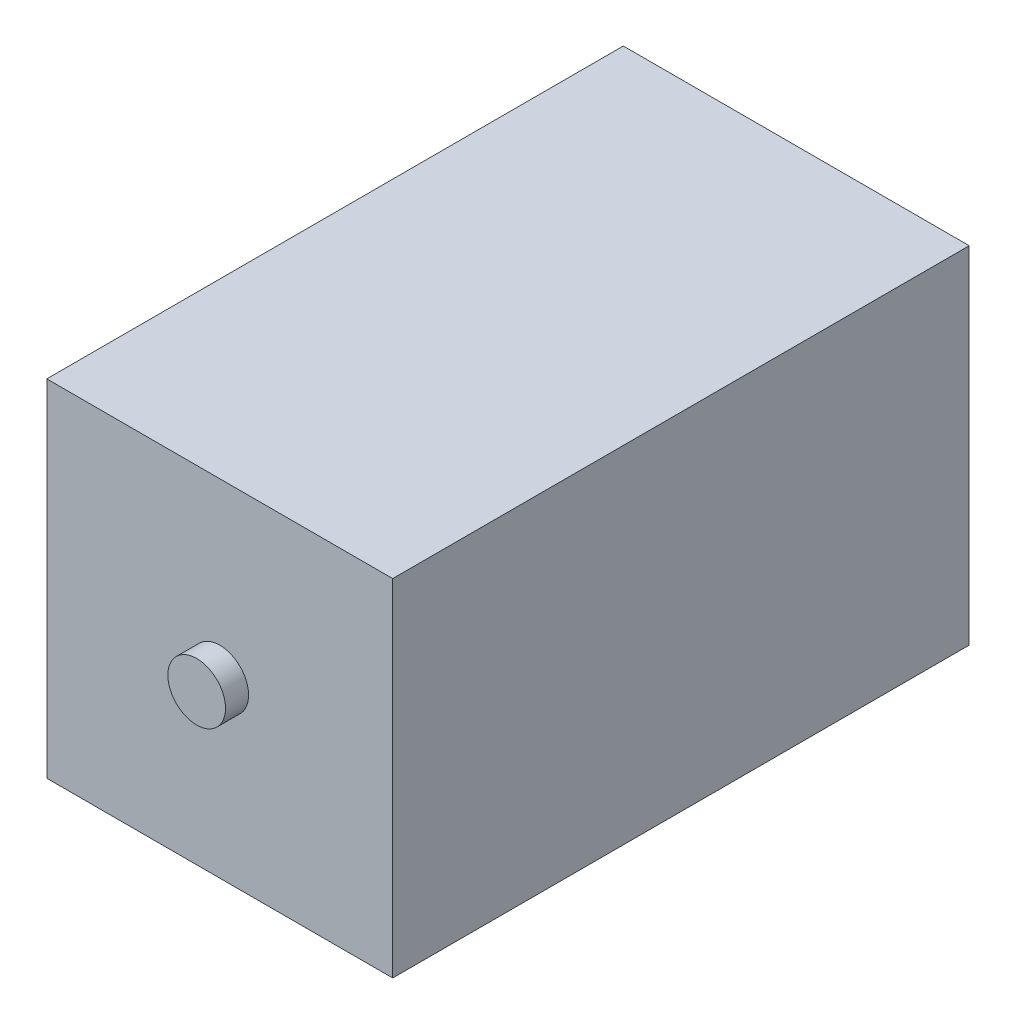
ISO-10303-21;
HEADER;
FILE_DESCRIPTION(('STEP AP214'),'2;1');
FILE_NAME('part.step','',(''),(''),'','','');
FILE_SCHEMA(('AUTOMOTIVE_DESIGN { 1 0 10303 214 1 1 1 1 }'));
ENDSEC;
DATA;
#1=APPLICATION_CONTEXT('core data for automotive mechanical design processes');
#2=APPLICATION_PROTOCOL_DEFINITION('international standard','automotive_design',2000,#1);
#3=PRODUCT_CONTEXT('',#1,'mechanical');
#4=PRODUCT('Part','Part','',(#3));
#5=PRODUCT_RELATED_PRODUCT_CATEGORY('part','',(#4));
#6=PRODUCT_DEFINITION_FORMATION('','',#4);
#7=PRODUCT_DEFINITION_CONTEXT('part definition',#1,'design');
#8=PRODUCT_DEFINITION('design','',#6,#7);
#9=PRODUCT_DEFINITION_SHAPE('','',#8);
#10=(LENGTH_UNIT() NAMED_UNIT(*) SI_UNIT(.MILLI.,.METRE.));
#11=(NAMED_UNIT(*) PLANE_ANGLE_UNIT() SI_UNIT($,.RADIAN.));
#12=(NAMED_UNIT(*) SI_UNIT($,.STERADIAN.) SOLID_ANGLE_UNIT());
#13=UNCERTAINTY_MEASURE_WITH_UNIT(LENGTH_MEASURE(1.E-05),#10,'distance_accuracy_value','');
#14=(GEOMETRIC_REPRESENTATION_CONTEXT(3) GLOBAL_UNCERTAINTY_ASSIGNED_CONTEXT((#13)) GLOBAL_UNIT_ASSIGNED_CONTEXT((#10,
#11,#12)) REPRESENTATION_CONTEXT('',''));
#15=CARTESIAN_POINT('',(0.,0.,0.));
#16=DIRECTION('',(0.,0.,1.));
#17=DIRECTION('',(1.,0.,0.));
#18=AXIS2_PLACEMENT_3D('',#15,#16,#17);
#19=CARTESIAN_POINT('',(0.,0.,250.));
#20=DIRECTION('',(0.,1.,0.));
#21=DIRECTION('',(0.,0.,1.));
#22=AXIS2_PLACEMENT_3D('',#19,#20,#21);
#23=PLANE('',#22);
#24=DIRECTION('',(1.,0.,0.));
#25=VECTOR('',#24,1.);
#26=CARTESIAN_POINT('',(0.,0.,0.));
#27=LINE('',#26,#25);
#28=CARTESIAN_POINT('',(0.,0.,0.));
#29=VERTEX_POINT('',#28);
#30=CARTESIAN_POINT('',(150.,0.,0.));
#31=VERTEX_POINT('',#30);
#32=EDGE_CURVE('E96',#29,#31,#27,.T.);
#33=ORIENTED_EDGE('',*,*,#32,.T.);
#34=DIRECTION('',(0.,0.,-1.));
#35=VECTOR('',#34,1.);
#36=CARTESIAN_POINT('',(150.,0.,250.));
#37=LINE('',#36,#35);
#38=CARTESIAN_POINT('',(150.,0.,250.));
#39=VERTEX_POINT('',#38);
#40=EDGE_CURVE('E11',#39,#31,#37,.T.);
#41=ORIENTED_EDGE('',*,*,#40,.F.);
#42=DIRECTION('',(1.,0.,0.));
#43=VECTOR('',#42,1.);
#44=CARTESIAN_POINT('',(0.,0.,250.));
#45=LINE('',#44,#43);
#46=CARTESIAN_POINT('',(0.,0.,250.));
#47=VERTEX_POINT('',#46);
#48=EDGE_CURVE('E84',#47,#39,#45,.T.);
#49=ORIENTED_EDGE('',*,*,#48,.F.);
#50=DIRECTION('',(0.,0.,-1.));
#51=VECTOR('',#50,1.);
#52=CARTESIAN_POINT('',(0.,0.,250.));
#53=LINE('',#52,#51);
#54=EDGE_CURVE('E92',#47,#29,#53,.T.);
#55=ORIENTED_EDGE('',*,*,#54,.T.);
#56=EDGE_LOOP('',(#33,#41,#49,#55));
#57=FACE_BOUND('',#56,.T.);
#58=ADVANCED_FACE('F33',(#57),#23,.F.);
#59=CARTESIAN_POINT('',(150.,0.,250.));
#60=DIRECTION('',(-1.,0.,0.));
#61=DIRECTION('',(0.,0.,1.));
#62=AXIS2_PLACEMENT_3D('',#59,#60,#61);
#63=PLANE('',#62);
#64=DIRECTION('',(0.,1.,0.));
#65=VECTOR('',#64,1.);
#66=CARTESIAN_POINT('',(150.,0.,0.));
#67=LINE('',#66,#65);
#68=CARTESIAN_POINT('',(150.,150.,0.));
#69=VERTEX_POINT('',#68);
#70=EDGE_CURVE('E88',#31,#69,#67,.T.);
#71=ORIENTED_EDGE('',*,*,#70,.T.);
#72=DIRECTION('',(0.,0.,-1.));
#73=VECTOR('',#72,1.);
#74=CARTESIAN_POINT('',(150.,150.,250.));
#75=LINE('',#74,#73);
#76=CARTESIAN_POINT('',(150.,150.,250.));
#77=VERTEX_POINT('',#76);
#78=EDGE_CURVE('E41',#77,#69,#75,.T.);
#79=ORIENTED_EDGE('',*,*,#78,.F.);
#80=DIRECTION('',(0.,1.,0.));
#81=VECTOR('',#80,1.);
#82=CARTESIAN_POINT('',(150.,0.,250.));
#83=LINE('',#82,#81);
#84=EDGE_CURVE('E79',#39,#77,#83,.T.);
#85=ORIENTED_EDGE('',*,*,#84,.F.);
#86=ORIENTED_EDGE('',*,*,#40,.T.);
#87=EDGE_LOOP('',(#71,#79,#85,#86));
#88=FACE_BOUND('',#87,.T.);
#89=ADVANCED_FACE('F87',(#88),#63,.F.);
#90=CARTESIAN_POINT('',(0.,150.,250.));
#91=DIRECTION('',(0.,-1.,0.));
#92=DIRECTION('',(0.,0.,-1.));
#93=AXIS2_PLACEMENT_3D('',#90,#91,#92);
#94=PLANE('',#93);
#95=DIRECTION('',(-1.,0.,0.));
#96=VECTOR('',#95,1.);
#97=CARTESIAN_POINT('',(0.,150.,0.));
#98=LINE('',#97,#96);
#99=CARTESIAN_POINT('',(0.,150.,0.));
#100=VERTEX_POINT('',#99);
#101=EDGE_CURVE('E66',#69,#100,#98,.T.);
#102=ORIENTED_EDGE('',*,*,#101,.T.);
#103=DIRECTION('',(0.,0.,-1.));
#104=VECTOR('',#103,1.);
#105=CARTESIAN_POINT('',(0.,150.,250.));
#106=LINE('',#105,#104);
#107=CARTESIAN_POINT('',(0.,150.,250.));
#108=VERTEX_POINT('',#107);
#109=EDGE_CURVE('E89',#108,#100,#106,.T.);
#110=ORIENTED_EDGE('',*,*,#109,.F.);
#111=DIRECTION('',(-1.,0.,0.));
#112=VECTOR('',#111,1.);
#113=CARTESIAN_POINT('',(0.,150.,250.));
#114=LINE('',#113,#112);
#115=EDGE_CURVE('E82',#77,#108,#114,.T.);
#116=ORIENTED_EDGE('',*,*,#115,.F.);
#117=ORIENTED_EDGE('',*,*,#78,.T.);
#118=EDGE_LOOP('',(#102,#110,#116,#117));
#119=FACE_BOUND('',#118,.T.);
#120=ADVANCED_FACE('F90',(#119),#94,.F.);
#121=CARTESIAN_POINT('',(0.,0.,250.));
#122=DIRECTION('',(1.,0.,0.));
#123=DIRECTION('',(0.,0.,-1.));
#124=AXIS2_PLACEMENT_3D('',#121,#122,#123);
#125=PLANE('',#124);
#126=DIRECTION('',(0.,-1.,0.));
#127=VECTOR('',#126,1.);
#128=CARTESIAN_POINT('',(0.,0.,0.));
#129=LINE('',#128,#127);
#130=EDGE_CURVE('E72',#100,#29,#129,.T.);
#131=ORIENTED_EDGE('',*,*,#130,.T.);
#132=ORIENTED_EDGE('',*,*,#54,.F.);
#133=DIRECTION('',(0.,-1.,0.));
#134=VECTOR('',#133,1.);
#135=CARTESIAN_POINT('',(0.,0.,250.));
#136=LINE('',#135,#134);
#137=EDGE_CURVE('E49',#108,#47,#136,.T.);
#138=ORIENTED_EDGE('',*,*,#137,.F.);
#139=ORIENTED_EDGE('',*,*,#109,.T.);
#140=EDGE_LOOP('',(#131,#132,#138,#139));
#141=FACE_BOUND('',#140,.T.);
#142=ADVANCED_FACE('F104',(#141),#125,.F.);
#143=CARTESIAN_POINT('',(0.,0.,250.));
#144=DIRECTION('',(0.,0.,1.));
#145=DIRECTION('',(1.,0.,0.));
#146=AXIS2_PLACEMENT_3D('',#143,#144,#145);
#147=PLANE('',#146);
#148=CARTESIAN_POINT('',(75.,75.,250.));
#149=DIRECTION('',(0.,0.,1.));
#150=DIRECTION('',(1.,0.,0.));
#151=AXIS2_PLACEMENT_3D('',#148,#149,#150);
#152=CIRCLE('',#151,12.5);
#153=CARTESIAN_POINT('',(87.5,75.,250.));
#154=VERTEX_POINT('',#153);
#155=EDGE_CURVE('E110',#154,#154,#152,.T.);
#156=ORIENTED_EDGE('',*,*,#155,.F.);
#157=EDGE_LOOP('',(#156));
#158=FACE_BOUND('',#157,.T.);
#159=ORIENTED_EDGE('',*,*,#48,.T.);
#160=ORIENTED_EDGE('',*,*,#84,.T.);
#161=ORIENTED_EDGE('',*,*,#115,.T.);
#162=ORIENTED_EDGE('',*,*,#137,.T.);
#163=EDGE_LOOP('',(#159,#160,#161,#162));
#164=FACE_BOUND('',#163,.T.);
#165=ADVANCED_FACE('F80',(#158,#164),#147,.T.);
#166=CARTESIAN_POINT('',(0.,0.,0.));
#167=DIRECTION('',(0.,0.,1.));
#168=DIRECTION('',(1.,0.,0.));
#169=AXIS2_PLACEMENT_3D('',#166,#167,#168);
#170=PLANE('',#169);
#171=ORIENTED_EDGE('',*,*,#32,.F.);
#172=ORIENTED_EDGE('',*,*,#130,.F.);
#173=ORIENTED_EDGE('',*,*,#101,.F.);
#174=ORIENTED_EDGE('',*,*,#70,.F.);
#175=EDGE_LOOP('',(#171,#172,#173,#174));
#176=FACE_BOUND('',#175,.T.);
#177=ADVANCED_FACE('F107',(#176),#170,.F.);
#178=CARTESIAN_POINT('',(75.,75.,260.));
#179=DIRECTION('',(0.,0.,-1.));
#180=DIRECTION('',(-1.,0.,0.));
#181=AXIS2_PLACEMENT_3D('',#178,#179,#180);
#182=CYLINDRICAL_SURFACE('',#181,12.5);
#183=CARTESIAN_POINT('',(75.,75.,260.));
#184=DIRECTION('',(0.,0.,1.));
#185=DIRECTION('',(1.,0.,0.));
#186=AXIS2_PLACEMENT_3D('',#183,#184,#185);
#187=CIRCLE('',#186,12.5);
#188=CARTESIAN_POINT('',(87.5,75.,260.));
#189=VERTEX_POINT('',#188);
#190=EDGE_CURVE('E99',#189,#189,#187,.T.);
#191=ORIENTED_EDGE('',*,*,#190,.F.);
#192=EDGE_LOOP('',(#191));
#193=FACE_BOUND('',#192,.T.);
#194=ORIENTED_EDGE('',*,*,#155,.T.);
#195=EDGE_LOOP('',(#194));
#196=FACE_BOUND('',#195,.T.);
#197=ADVANCED_FACE('F118',(#193,#196),#182,.T.);
#198=CARTESIAN_POINT('',(75.,75.,260.));
#199=DIRECTION('',(0.,0.,1.));
#200=DIRECTION('',(1.,0.,0.));
#201=AXIS2_PLACEMENT_3D('',#198,#199,#200);
#202=PLANE('',#201);
#203=ORIENTED_EDGE('',*,*,#190,.T.);
#204=EDGE_LOOP('',(#203));
#205=FACE_BOUND('',#204,.T.);
#206=ADVANCED_FACE('F116',(#205),#202,.T.);
#207=CLOSED_SHELL('',(#58,#89,#120,#142,#165,#177,#197,#206));
#208=MANIFOLD_SOLID_BREP('B2',#207);
#209=ADVANCED_BREP_SHAPE_REPRESENTATION('',(#18,#208),#14);
#210=SHAPE_DEFINITION_REPRESENTATION(#9,#209);
ENDSEC;
END-ISO-10303-21;
